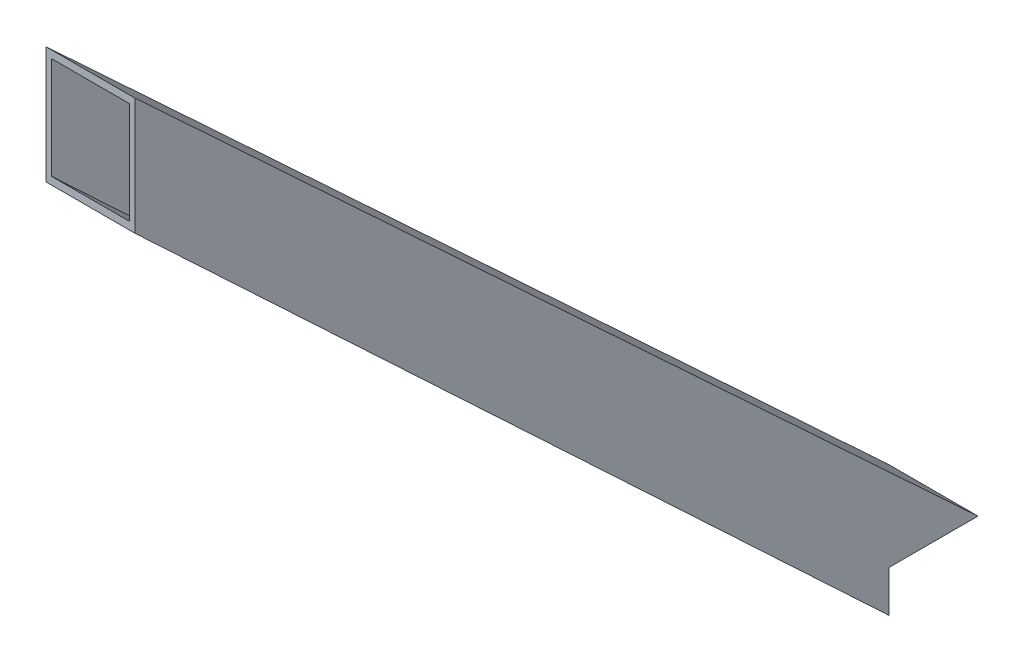
ISO-10303-21;
HEADER;
FILE_DESCRIPTION(('STEP AP214'),'2;1');
FILE_NAME('part.step','',(''),(''),'','','');
FILE_SCHEMA(('AUTOMOTIVE_DESIGN { 1 0 10303 214 1 1 1 1 }'));
ENDSEC;
DATA;
#1=APPLICATION_CONTEXT('core data for automotive mechanical design processes');
#2=APPLICATION_PROTOCOL_DEFINITION('international standard','automotive_design',2000,#1);
#3=PRODUCT_CONTEXT('',#1,'mechanical');
#4=PRODUCT('Part','Part','',(#3));
#5=PRODUCT_RELATED_PRODUCT_CATEGORY('part','',(#4));
#6=PRODUCT_DEFINITION_FORMATION('','',#4);
#7=PRODUCT_DEFINITION_CONTEXT('part definition',#1,'design');
#8=PRODUCT_DEFINITION('design','',#6,#7);
#9=PRODUCT_DEFINITION_SHAPE('','',#8);
#10=(LENGTH_UNIT() NAMED_UNIT(*) SI_UNIT(.MILLI.,.METRE.));
#11=(NAMED_UNIT(*) PLANE_ANGLE_UNIT() SI_UNIT($,.RADIAN.));
#12=(NAMED_UNIT(*) SI_UNIT($,.STERADIAN.) SOLID_ANGLE_UNIT());
#13=UNCERTAINTY_MEASURE_WITH_UNIT(LENGTH_MEASURE(1.E-05),#10,'distance_accuracy_value','');
#14=(GEOMETRIC_REPRESENTATION_CONTEXT(3) GLOBAL_UNCERTAINTY_ASSIGNED_CONTEXT((#13)) GLOBAL_UNIT_ASSIGNED_CONTEXT((#10,
#11,#12)) REPRESENTATION_CONTEXT('',''));
#15=CARTESIAN_POINT('',(0.,0.,0.));
#16=DIRECTION('',(0.,0.,1.));
#17=DIRECTION('',(1.,0.,0.));
#18=AXIS2_PLACEMENT_3D('',#15,#16,#17);
#19=CARTESIAN_POINT('',(-28.575,229.257148001638,269.885000000056));
#20=DIRECTION('',(0.,0.,-1.));
#21=DIRECTION('',(0.,1.,0.));
#22=AXIS2_PLACEMENT_3D('',#19,#20,#21);
#23=PLANE('',#22);
#24=DIRECTION('',(1.,0.,0.));
#25=VECTOR('',#24,1.);
#26=CARTESIAN_POINT('',(-28.575,213.33196153798,269.885000000056));
#27=LINE('',#26,#25);
#28=CARTESIAN_POINT('',(-28.575,213.33196153798,269.885000000056));
#29=VERTEX_POINT('',#28);
#30=CARTESIAN_POINT('',(0.,213.33196153798,269.885000000056));
#31=VERTEX_POINT('',#30);
#32=EDGE_CURVE('E132',#29,#31,#27,.T.);
#33=ORIENTED_EDGE('',*,*,#32,.T.);
#34=DIRECTION('',(0.,1.,0.));
#35=VECTOR('',#34,1.);
#36=CARTESIAN_POINT('',(0.,229.257148001638,269.885000000056));
#37=LINE('',#36,#35);
#38=CARTESIAN_POINT('',(0.,250.824999999999,269.885000000056));
#39=VERTEX_POINT('',#38);
#40=EDGE_CURVE('E143',#31,#39,#37,.T.);
#41=ORIENTED_EDGE('',*,*,#40,.T.);
#42=DIRECTION('',(1.,0.,0.));
#43=VECTOR('',#42,1.);
#44=CARTESIAN_POINT('',(-28.575,250.824999999999,269.885000000056));
#45=LINE('',#44,#43);
#46=CARTESIAN_POINT('',(-28.575,250.824999999999,269.885000000056));
#47=VERTEX_POINT('',#46);
#48=EDGE_CURVE('E140',#47,#39,#45,.T.);
#49=ORIENTED_EDGE('',*,*,#48,.F.);
#50=DIRECTION('',(0.,1.,0.));
#51=VECTOR('',#50,1.);
#52=CARTESIAN_POINT('',(-28.575,229.257148001638,269.885000000056));
#53=LINE('',#52,#51);
#54=EDGE_CURVE('E138',#29,#47,#53,.T.);
#55=ORIENTED_EDGE('',*,*,#54,.F.);
#56=EDGE_LOOP('',(#33,#41,#49,#55));
#57=FACE_BOUND('',#56,.T.);
#58=DIRECTION('',(1.,0.,0.));
#59=VECTOR('',#58,1.);
#60=CARTESIAN_POINT('',(-28.575,215.764656867769,269.885000000056));
#61=LINE('',#60,#59);
#62=CARTESIAN_POINT('',(-26.801445,215.764656867769,269.885000000056));
#63=VERTEX_POINT('',#62);
#64=CARTESIAN_POINT('',(-1.77355499999999,215.764656867769,269.885000000056));
#65=VERTEX_POINT('',#64);
#66=EDGE_CURVE('E101',#63,#65,#61,.T.);
#67=ORIENTED_EDGE('',*,*,#66,.F.);
#68=DIRECTION('',(0.,1.,0.));
#69=VECTOR('',#68,1.);
#70=CARTESIAN_POINT('',(-26.801445,229.257148001638,269.885000000056));
#71=LINE('',#70,#69);
#72=CARTESIAN_POINT('',(-26.801445,248.40376143653,269.885000000056));
#73=VERTEX_POINT('',#72);
#74=EDGE_CURVE('E91',#63,#73,#71,.T.);
#75=ORIENTED_EDGE('',*,*,#74,.T.);
#76=DIRECTION('',(1.,0.,0.));
#77=VECTOR('',#76,1.);
#78=CARTESIAN_POINT('',(-28.575,248.40376143653,269.885000000056));
#79=LINE('',#78,#77);
#80=CARTESIAN_POINT('',(-1.77355499999998,248.40376143653,269.885000000056));
#81=VERTEX_POINT('',#80);
#82=EDGE_CURVE('E98',#73,#81,#79,.T.);
#83=ORIENTED_EDGE('',*,*,#82,.T.);
#84=DIRECTION('',(0.,1.,0.));
#85=VECTOR('',#84,1.);
#86=CARTESIAN_POINT('',(-1.77355499999999,229.257148001638,269.885000000056));
#87=LINE('',#86,#85);
#88=EDGE_CURVE('E106',#65,#81,#87,.T.);
#89=ORIENTED_EDGE('',*,*,#88,.F.);
#90=EDGE_LOOP('',(#67,#75,#83,#89));
#91=FACE_BOUND('',#90,.T.);
#92=ADVANCED_FACE('F15',(#57,#91),#23,.F.);
#93=CARTESIAN_POINT('',(-28.575,0.,0.));
#94=DIRECTION('',(0.,-1.,0.));
#95=DIRECTION('',(0.,0.,-1.));
#96=AXIS2_PLACEMENT_3D('',#93,#94,#95);
#97=PLANE('',#96);
#98=DIRECTION('',(1.,0.,0.));
#99=VECTOR('',#98,1.);
#100=CARTESIAN_POINT('',(-28.575,0.,28.575));
#101=LINE('',#100,#99);
#102=CARTESIAN_POINT('',(-1.773555,0.,28.575));
#103=VERTEX_POINT('',#102);
#104=CARTESIAN_POINT('',(0.,0.,28.575));
#105=VERTEX_POINT('',#104);
#106=EDGE_CURVE('E154',#103,#105,#101,.T.);
#107=ORIENTED_EDGE('',*,*,#106,.F.);
#108=DIRECTION('',(0.,0.,-1.));
#109=VECTOR('',#108,1.);
#110=CARTESIAN_POINT('',(-1.773555,0.,0.));
#111=LINE('',#110,#109);
#112=CARTESIAN_POINT('',(-1.773555,0.,2.60522663092605));
#113=VERTEX_POINT('',#112);
#114=EDGE_CURVE('E114',#103,#113,#111,.T.);
#115=ORIENTED_EDGE('',*,*,#114,.T.);
#116=DIRECTION('',(1.,0.,0.));
#117=VECTOR('',#116,1.);
#118=CARTESIAN_POINT('',(-28.575,0.,2.60522663092611));
#119=LINE('',#118,#117);
#120=CARTESIAN_POINT('',(-26.801445,0.,2.60522663092608));
#121=VERTEX_POINT('',#120);
#122=EDGE_CURVE('E119',#121,#113,#119,.T.);
#123=ORIENTED_EDGE('',*,*,#122,.F.);
#124=DIRECTION('',(0.,0.,-1.));
#125=VECTOR('',#124,1.);
#126=CARTESIAN_POINT('',(-26.801445,0.,0.));
#127=LINE('',#126,#125);
#128=CARTESIAN_POINT('',(-26.801445,0.,28.575));
#129=VERTEX_POINT('',#128);
#130=EDGE_CURVE('E115',#129,#121,#127,.T.);
#131=ORIENTED_EDGE('',*,*,#130,.F.);
#132=CARTESIAN_POINT('',(-28.575,0.,28.575));
#133=VERTEX_POINT('',#132);
#134=EDGE_CURVE('E165',#133,#129,#101,.T.);
#135=ORIENTED_EDGE('',*,*,#134,.F.);
#136=DIRECTION('',(0.,0.,-1.));
#137=VECTOR('',#136,1.);
#138=CARTESIAN_POINT('',(-28.575,0.,0.));
#139=LINE('',#138,#137);
#140=CARTESIAN_POINT('',(-28.575,0.,0.));
#141=VERTEX_POINT('',#140);
#142=EDGE_CURVE('E155',#133,#141,#139,.T.);
#143=ORIENTED_EDGE('',*,*,#142,.T.);
#144=DIRECTION('',(1.,0.,0.));
#145=VECTOR('',#144,1.);
#146=CARTESIAN_POINT('',(-28.575,0.,0.));
#147=LINE('',#146,#145);
#148=CARTESIAN_POINT('',(0.,0.,0.));
#149=VERTEX_POINT('',#148);
#150=EDGE_CURVE('E9',#141,#149,#147,.T.);
#151=ORIENTED_EDGE('',*,*,#150,.T.);
#152=DIRECTION('',(0.,0.,-1.));
#153=VECTOR('',#152,1.);
#154=CARTESIAN_POINT('',(0.,0.,0.));
#155=LINE('',#154,#153);
#156=EDGE_CURVE('E150',#105,#149,#155,.T.);
#157=ORIENTED_EDGE('',*,*,#156,.F.);
#158=EDGE_LOOP('',(#107,#115,#123,#131,#135,#143,#151,#157));
#159=FACE_BOUND('',#158,.T.);
#160=ADVANCED_FACE('F17',(#159),#97,.T.);
#161=CARTESIAN_POINT('',(-28.575,0.,28.575));
#162=DIRECTION('',(0.,0.,-1.));
#163=DIRECTION('',(-1.,0.,0.));
#164=AXIS2_PLACEMENT_3D('',#161,#162,#163);
#165=PLANE('',#164);
#166=DIRECTION('',(1.,0.,0.));
#167=VECTOR('',#166,1.);
#168=CARTESIAN_POINT('',(-28.575,-10.7869563039687,28.575));
#169=LINE('',#168,#167);
#170=CARTESIAN_POINT('',(-26.801445,-10.7869563039687,28.575));
#171=VERTEX_POINT('',#170);
#172=CARTESIAN_POINT('',(-1.773555,-10.7869563039687,28.575));
#173=VERTEX_POINT('',#172);
#174=EDGE_CURVE('E38',#171,#173,#169,.T.);
#175=ORIENTED_EDGE('',*,*,#174,.T.);
#176=DIRECTION('',(0.,1.,0.));
#177=VECTOR('',#176,1.);
#178=CARTESIAN_POINT('',(-1.773555,0.,28.575));
#179=LINE('',#178,#177);
#180=EDGE_CURVE('E118',#173,#103,#179,.T.);
#181=ORIENTED_EDGE('',*,*,#180,.T.);
#182=ORIENTED_EDGE('',*,*,#106,.T.);
#183=DIRECTION('',(0.,1.,0.));
#184=VECTOR('',#183,1.);
#185=CARTESIAN_POINT('',(0.,0.,28.575));
#186=LINE('',#185,#184);
#187=CARTESIAN_POINT('',(0.,-13.2196516337571,28.575));
#188=VERTEX_POINT('',#187);
#189=EDGE_CURVE('E158',#188,#105,#186,.T.);
#190=ORIENTED_EDGE('',*,*,#189,.F.);
#191=DIRECTION('',(1.,0.,0.));
#192=VECTOR('',#191,1.);
#193=CARTESIAN_POINT('',(-28.575,-13.2196516337571,28.575));
#194=LINE('',#193,#192);
#195=CARTESIAN_POINT('',(-28.575,-13.2196516337571,28.575));
#196=VERTEX_POINT('',#195);
#197=EDGE_CURVE('E23',#196,#188,#194,.T.);
#198=ORIENTED_EDGE('',*,*,#197,.F.);
#199=DIRECTION('',(0.,1.,0.));
#200=VECTOR('',#199,1.);
#201=CARTESIAN_POINT('',(-28.575,0.,28.575));
#202=LINE('',#201,#200);
#203=EDGE_CURVE('E151',#196,#133,#202,.T.);
#204=ORIENTED_EDGE('',*,*,#203,.T.);
#205=ORIENTED_EDGE('',*,*,#134,.T.);
#206=DIRECTION('',(0.,1.,0.));
#207=VECTOR('',#206,1.);
#208=CARTESIAN_POINT('',(-26.801445,0.,28.575));
#209=LINE('',#208,#207);
#210=EDGE_CURVE('E117',#171,#129,#209,.T.);
#211=ORIENTED_EDGE('',*,*,#210,.F.);
#212=EDGE_LOOP('',(#175,#181,#182,#190,#198,#204,#205,#211));
#213=FACE_BOUND('',#212,.T.);
#214=ADVANCED_FACE('F180',(#213),#165,.T.);
#215=CARTESIAN_POINT('',(-28.575,0.,0.));
#216=DIRECTION('',(-1.,0.,0.));
#217=DIRECTION('',(0.,-1.,0.));
#218=AXIS2_PLACEMENT_3D('',#215,#216,#217);
#219=PLANE('',#218);
#220=DIRECTION('',(0.,0.684461112594901,0.729049370993042));
#221=VECTOR('',#220,1.);
#222=CARTESIAN_POINT('',(-28.575,213.33196153798,269.885000000056));
#223=LINE('',#222,#221);
#224=EDGE_CURVE('E129',#196,#29,#223,.T.);
#225=ORIENTED_EDGE('',*,*,#224,.T.);
#226=ORIENTED_EDGE('',*,*,#54,.T.);
#227=DIRECTION('',(0.,-0.680768029524363,-0.732499071656419));
#228=VECTOR('',#227,1.);
#229=CARTESIAN_POINT('',(-28.575,250.824999999999,269.885000000056));
#230=LINE('',#229,#228);
#231=EDGE_CURVE('E141',#47,#141,#230,.T.);
#232=ORIENTED_EDGE('',*,*,#231,.T.);
#233=ORIENTED_EDGE('',*,*,#142,.F.);
#234=ORIENTED_EDGE('',*,*,#203,.F.);
#235=EDGE_LOOP('',(#225,#226,#232,#233,#234));
#236=FACE_BOUND('',#235,.T.);
#237=ADVANCED_FACE('F192',(#236),#219,.T.);
#238=CARTESIAN_POINT('',(0.,0.,0.));
#239=DIRECTION('',(-1.,0.,0.));
#240=DIRECTION('',(0.,-1.,0.));
#241=AXIS2_PLACEMENT_3D('',#238,#239,#240);
#242=PLANE('',#241);
#243=ORIENTED_EDGE('',*,*,#40,.F.);
#244=DIRECTION('',(0.,0.684461112594901,0.729049370993042));
#245=VECTOR('',#244,1.);
#246=CARTESIAN_POINT('',(0.,213.33196153798,269.885000000056));
#247=LINE('',#246,#245);
#248=EDGE_CURVE('E122',#188,#31,#247,.T.);
#249=ORIENTED_EDGE('',*,*,#248,.F.);
#250=ORIENTED_EDGE('',*,*,#189,.T.);
#251=ORIENTED_EDGE('',*,*,#156,.T.);
#252=DIRECTION('',(0.,-0.680768029524363,-0.732499071656419));
#253=VECTOR('',#252,1.);
#254=CARTESIAN_POINT('',(0.,250.824999999999,269.885000000056));
#255=LINE('',#254,#253);
#256=EDGE_CURVE('E137',#39,#149,#255,.T.);
#257=ORIENTED_EDGE('',*,*,#256,.F.);
#258=EDGE_LOOP('',(#243,#249,#250,#251,#257));
#259=FACE_BOUND('',#258,.T.);
#260=ADVANCED_FACE('F177',(#259),#242,.F.);
#261=CARTESIAN_POINT('',(-28.575,250.824999999999,269.885000000056));
#262=DIRECTION('',(0.,-0.732499071656419,0.680768029524363));
#263=DIRECTION('',(0.,-0.680768029524363,-0.732499071656419));
#264=AXIS2_PLACEMENT_3D('',#261,#262,#263);
#265=PLANE('',#264);
#266=ORIENTED_EDGE('',*,*,#256,.T.);
#267=ORIENTED_EDGE('',*,*,#150,.F.);
#268=ORIENTED_EDGE('',*,*,#231,.F.);
#269=ORIENTED_EDGE('',*,*,#48,.T.);
#270=EDGE_LOOP('',(#266,#267,#268,#269));
#271=FACE_BOUND('',#270,.T.);
#272=ADVANCED_FACE('F187',(#271),#265,.F.);
#273=CARTESIAN_POINT('',(-28.575,213.33196153798,269.885000000056));
#274=DIRECTION('',(0.,0.729049370993042,-0.684461112594902));
#275=DIRECTION('',(0.,0.684461112594901,0.729049370993042));
#276=AXIS2_PLACEMENT_3D('',#273,#274,#275);
#277=PLANE('',#276);
#278=ORIENTED_EDGE('',*,*,#248,.T.);
#279=ORIENTED_EDGE('',*,*,#32,.F.);
#280=ORIENTED_EDGE('',*,*,#224,.F.);
#281=ORIENTED_EDGE('',*,*,#197,.T.);
#282=EDGE_LOOP('',(#278,#279,#280,#281));
#283=FACE_BOUND('',#282,.T.);
#284=ADVANCED_FACE('F170',(#283),#277,.F.);
#285=CARTESIAN_POINT('',(-26.801445,0.,0.));
#286=DIRECTION('',(-1.,0.,0.));
#287=DIRECTION('',(0.,-1.,0.));
#288=AXIS2_PLACEMENT_3D('',#285,#286,#287);
#289=PLANE('',#288);
#290=DIRECTION('',(0.,0.684461112594901,0.729049370993042));
#291=VECTOR('',#290,1.);
#292=CARTESIAN_POINT('',(-26.801445,214.624970695152,268.671070571508));
#293=LINE('',#292,#291);
#294=EDGE_CURVE('E93',#171,#63,#293,.T.);
#295=ORIENTED_EDGE('',*,*,#294,.F.);
#296=ORIENTED_EDGE('',*,*,#210,.T.);
#297=ORIENTED_EDGE('',*,*,#130,.T.);
#298=DIRECTION('',(0.,-0.680768029524363,-0.732499071656419));
#299=VECTOR('',#298,1.);
#300=CARTESIAN_POINT('',(-26.801445,249.525872608968,271.092379542659));
#301=LINE('',#300,#299);
#302=EDGE_CURVE('E30',#73,#121,#301,.T.);
#303=ORIENTED_EDGE('',*,*,#302,.F.);
#304=ORIENTED_EDGE('',*,*,#74,.F.);
#305=EDGE_LOOP('',(#295,#296,#297,#303,#304));
#306=FACE_BOUND('',#305,.T.);
#307=ADVANCED_FACE('F92',(#306),#289,.F.);
#308=CARTESIAN_POINT('',(-1.773555,0.,0.));
#309=DIRECTION('',(-1.,0.,0.));
#310=DIRECTION('',(0.,-1.,0.));
#311=AXIS2_PLACEMENT_3D('',#308,#309,#310);
#312=PLANE('',#311);
#313=ORIENTED_EDGE('',*,*,#88,.T.);
#314=DIRECTION('',(0.,-0.680768029524363,-0.732499071656419));
#315=VECTOR('',#314,1.);
#316=CARTESIAN_POINT('',(-1.77355499999999,249.525872608968,271.092379542659));
#317=LINE('',#316,#315);
#318=EDGE_CURVE('E107',#81,#113,#317,.T.);
#319=ORIENTED_EDGE('',*,*,#318,.T.);
#320=ORIENTED_EDGE('',*,*,#114,.F.);
#321=ORIENTED_EDGE('',*,*,#180,.F.);
#322=DIRECTION('',(0.,0.684461112594901,0.729049370993042));
#323=VECTOR('',#322,1.);
#324=CARTESIAN_POINT('',(-1.77355499999999,214.624970695152,268.671070571508));
#325=LINE('',#324,#323);
#326=EDGE_CURVE('E103',#173,#65,#325,.T.);
#327=ORIENTED_EDGE('',*,*,#326,.T.);
#328=EDGE_LOOP('',(#313,#319,#320,#321,#327));
#329=FACE_BOUND('',#328,.T.);
#330=ADVANCED_FACE('F200',(#329),#312,.T.);
#331=CARTESIAN_POINT('',(-28.575,249.525872608968,271.092379542659));
#332=DIRECTION('',(0.,-0.732499071656419,0.680768029524363));
#333=DIRECTION('',(0.,-0.680768029524363,-0.732499071656419));
#334=AXIS2_PLACEMENT_3D('',#331,#332,#333);
#335=PLANE('',#334);
#336=ORIENTED_EDGE('',*,*,#318,.F.);
#337=ORIENTED_EDGE('',*,*,#82,.F.);
#338=ORIENTED_EDGE('',*,*,#302,.T.);
#339=ORIENTED_EDGE('',*,*,#122,.T.);
#340=EDGE_LOOP('',(#336,#337,#338,#339));
#341=FACE_BOUND('',#340,.T.);
#342=ADVANCED_FACE('F197',(#341),#335,.T.);
#343=CARTESIAN_POINT('',(-28.575,214.624970695152,268.671070571508));
#344=DIRECTION('',(0.,0.729049370993042,-0.684461112594902));
#345=DIRECTION('',(0.,0.684461112594901,0.729049370993042));
#346=AXIS2_PLACEMENT_3D('',#343,#344,#345);
#347=PLANE('',#346);
#348=ORIENTED_EDGE('',*,*,#326,.F.);
#349=ORIENTED_EDGE('',*,*,#174,.F.);
#350=ORIENTED_EDGE('',*,*,#294,.T.);
#351=ORIENTED_EDGE('',*,*,#66,.T.);
#352=EDGE_LOOP('',(#348,#349,#350,#351));
#353=FACE_BOUND('',#352,.T.);
#354=ADVANCED_FACE('F100',(#353),#347,.T.);
#355=CLOSED_SHELL('',(#92,#160,#214,#237,#260,#272,#284,#307,#330,#342,#354));
#356=MANIFOLD_SOLID_BREP('B1',#355);
#357=ADVANCED_BREP_SHAPE_REPRESENTATION('',(#18,#356),#14);
#358=SHAPE_DEFINITION_REPRESENTATION(#9,#357);
ENDSEC;
END-ISO-10303-21;
